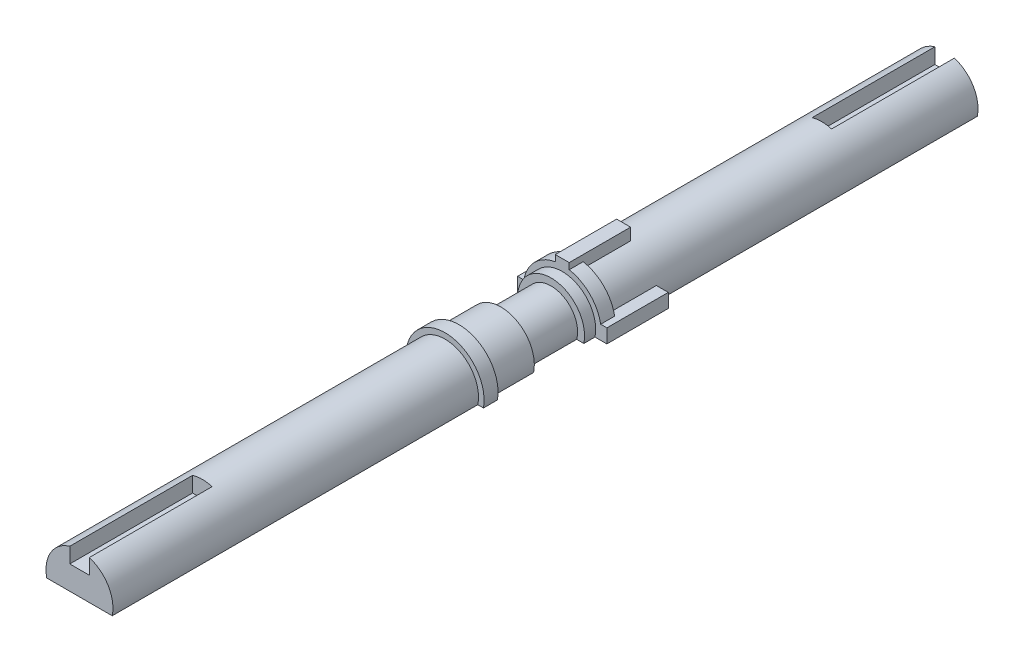
ISO-10303-21;
HEADER;
FILE_DESCRIPTION(('STEP AP214'),'2;1');
FILE_NAME('part.step','',(''),(''),'','','');
FILE_SCHEMA(('AUTOMOTIVE_DESIGN { 1 0 10303 214 1 1 1 1 }'));
ENDSEC;
DATA;
#1=APPLICATION_CONTEXT('core data for automotive mechanical design processes');
#2=APPLICATION_PROTOCOL_DEFINITION('international standard','automotive_design',2000,#1);
#3=PRODUCT_CONTEXT('',#1,'mechanical');
#4=PRODUCT('Part','Part','',(#3));
#5=PRODUCT_RELATED_PRODUCT_CATEGORY('part','',(#4));
#6=PRODUCT_DEFINITION_FORMATION('','',#4);
#7=PRODUCT_DEFINITION_CONTEXT('part definition',#1,'design');
#8=PRODUCT_DEFINITION('design','',#6,#7);
#9=PRODUCT_DEFINITION_SHAPE('','',#8);
#10=(LENGTH_UNIT() NAMED_UNIT(*) SI_UNIT(.MILLI.,.METRE.));
#11=(NAMED_UNIT(*) PLANE_ANGLE_UNIT() SI_UNIT($,.RADIAN.));
#12=(NAMED_UNIT(*) SI_UNIT($,.STERADIAN.) SOLID_ANGLE_UNIT());
#13=UNCERTAINTY_MEASURE_WITH_UNIT(LENGTH_MEASURE(1.E-05),#10,'distance_accuracy_value','');
#14=(GEOMETRIC_REPRESENTATION_CONTEXT(3) GLOBAL_UNCERTAINTY_ASSIGNED_CONTEXT((#13)) GLOBAL_UNIT_ASSIGNED_CONTEXT((#10,
#11,#12)) REPRESENTATION_CONTEXT('',''));
#15=CARTESIAN_POINT('',(0.,0.,0.));
#16=DIRECTION('',(0.,0.,1.));
#17=DIRECTION('',(1.,0.,0.));
#18=AXIS2_PLACEMENT_3D('',#15,#16,#17);
#19=CARTESIAN_POINT('',(0.,0.,26.5));
#20=DIRECTION('',(0.,0.,1.));
#21=DIRECTION('',(1.,0.,0.));
#22=AXIS2_PLACEMENT_3D('',#19,#20,#21);
#23=CYLINDRICAL_SURFACE('',#22,7.);
#24=CARTESIAN_POINT('',(0.,0.,29.));
#25=DIRECTION('',(0.,0.,1.));
#26=DIRECTION('',(1.,0.,0.));
#27=AXIS2_PLACEMENT_3D('',#24,#25,#26);
#28=CIRCLE('',#27,7.);
#29=CARTESIAN_POINT('',(6.88748865697795,-1.25,29.));
#30=VERTEX_POINT('',#29);
#31=CARTESIAN_POINT('',(-6.88748865697795,-1.25,29.));
#32=VERTEX_POINT('',#31);
#33=EDGE_CURVE('E77',#30,#32,#28,.T.);
#34=ORIENTED_EDGE('',*,*,#33,.F.);
#35=DIRECTION('',(0.,0.,1.));
#36=VECTOR('',#35,1.);
#37=CARTESIAN_POINT('',(6.88748865697795,-1.25,26.5));
#38=LINE('',#37,#36);
#39=CARTESIAN_POINT('',(6.88748865697795,-1.25,26.5));
#40=VERTEX_POINT('',#39);
#41=EDGE_CURVE('E12',#40,#30,#38,.T.);
#42=ORIENTED_EDGE('',*,*,#41,.F.);
#43=CARTESIAN_POINT('',(0.,0.,26.5));
#44=DIRECTION('',(0.,0.,1.));
#45=DIRECTION('',(1.,0.,0.));
#46=AXIS2_PLACEMENT_3D('',#43,#44,#45);
#47=CIRCLE('',#46,7.);
#48=CARTESIAN_POINT('',(-6.88748865697795,-1.25,26.5));
#49=VERTEX_POINT('',#48);
#50=EDGE_CURVE('E81',#40,#49,#47,.T.);
#51=ORIENTED_EDGE('',*,*,#50,.T.);
#52=DIRECTION('',(0.,0.,1.));
#53=VECTOR('',#52,1.);
#54=CARTESIAN_POINT('',(-6.88748865697795,-1.25,26.5));
#55=LINE('',#54,#53);
#56=EDGE_CURVE('E51',#49,#32,#55,.T.);
#57=ORIENTED_EDGE('',*,*,#56,.T.);
#58=EDGE_LOOP('',(#34,#42,#51,#57));
#59=FACE_BOUND('',#58,.T.);
#60=ADVANCED_FACE('F48',(#59),#23,.T.);
#61=CARTESIAN_POINT('',(-6.88748865697795,-1.25,26.5));
#62=DIRECTION('',(0.,-1.,0.));
#63=DIRECTION('',(1.,0.,0.));
#64=AXIS2_PLACEMENT_3D('',#61,#62,#63);
#65=PLANE('',#64);
#66=DIRECTION('',(1.,0.,0.));
#67=VECTOR('',#66,1.);
#68=CARTESIAN_POINT('',(-6.88748865697795,-1.25,29.));
#69=LINE('',#68,#67);
#70=EDGE_CURVE('E74',#32,#30,#69,.T.);
#71=ORIENTED_EDGE('',*,*,#70,.F.);
#72=ORIENTED_EDGE('',*,*,#56,.F.);
#73=DIRECTION('',(1.,0.,0.));
#74=VECTOR('',#73,1.);
#75=CARTESIAN_POINT('',(-6.88748865697795,-1.25,26.5));
#76=LINE('',#75,#74);
#77=EDGE_CURVE('E76',#49,#40,#76,.T.);
#78=ORIENTED_EDGE('',*,*,#77,.T.);
#79=ORIENTED_EDGE('',*,*,#41,.T.);
#80=EDGE_LOOP('',(#71,#72,#78,#79));
#81=FACE_BOUND('',#80,.T.);
#82=ADVANCED_FACE('F72',(#81),#65,.T.);
#83=CARTESIAN_POINT('',(0.,0.,26.5));
#84=DIRECTION('',(0.,0.,1.));
#85=DIRECTION('',(1.,0.,0.));
#86=AXIS2_PLACEMENT_3D('',#83,#84,#85);
#87=PLANE('',#86);
#88=ORIENTED_EDGE('',*,*,#50,.F.);
#89=ORIENTED_EDGE('',*,*,#77,.F.);
#90=EDGE_LOOP('',(#88,#89));
#91=FACE_BOUND('',#90,.T.);
#92=ADVANCED_FACE('F86',(#91),#87,.F.);
#93=CARTESIAN_POINT('',(0.,0.,29.));
#94=DIRECTION('',(0.,0.,1.));
#95=DIRECTION('',(1.,0.,0.));
#96=AXIS2_PLACEMENT_3D('',#93,#94,#95);
#97=PLANE('',#96);
#98=ORIENTED_EDGE('',*,*,#33,.T.);
#99=ORIENTED_EDGE('',*,*,#70,.T.);
#100=EDGE_LOOP('',(#98,#99));
#101=FACE_BOUND('',#100,.T.);
#102=ADVANCED_FACE('F80',(#101),#97,.T.);
#103=CLOSED_SHELL('',(#60,#82,#92,#102));
#104=MANIFOLD_SOLID_BREP('B2',#103);
#105=CARTESIAN_POINT('',(0.,0.,8.));
#106=DIRECTION('',(0.,0.,-1.));
#107=DIRECTION('',(-1.,0.,0.));
#108=AXIS2_PLACEMENT_3D('',#105,#106,#107);
#109=CYLINDRICAL_SURFACE('',#108,6.);
#110=CARTESIAN_POINT('',(0.,0.,10.));
#111=DIRECTION('',(0.,0.,1.));
#112=DIRECTION('',(1.,0.,0.));
#113=AXIS2_PLACEMENT_3D('',#110,#111,#112);
#114=CIRCLE('',#113,6.);
#115=CARTESIAN_POINT('',(5.86834729715275,-1.25,10.));
#116=VERTEX_POINT('',#115);
#117=CARTESIAN_POINT('',(-5.86834729715275,-1.25,10.));
#118=VERTEX_POINT('',#117);
#119=EDGE_CURVE('E324',#116,#118,#114,.T.);
#120=ORIENTED_EDGE('',*,*,#119,.F.);
#121=DIRECTION('',(0.,0.,-1.));
#122=VECTOR('',#121,1.);
#123=CARTESIAN_POINT('',(5.86834729715275,-1.25,34.));
#124=LINE('',#123,#122);
#125=CARTESIAN_POINT('',(5.86834729715275,-1.25,8.));
#126=VERTEX_POINT('',#125);
#127=EDGE_CURVE('E403',#116,#126,#124,.T.);
#128=ORIENTED_EDGE('',*,*,#127,.T.);
#129=CARTESIAN_POINT('',(0.,0.,8.));
#130=DIRECTION('',(0.,0.,1.));
#131=DIRECTION('',(1.,0.,0.));
#132=AXIS2_PLACEMENT_3D('',#129,#130,#131);
#133=CIRCLE('',#132,6.);
#134=CARTESIAN_POINT('',(-5.86834729715275,-1.25,8.));
#135=VERTEX_POINT('',#134);
#136=EDGE_CURVE('E389',#126,#135,#133,.T.);
#137=ORIENTED_EDGE('',*,*,#136,.T.);
#138=DIRECTION('',(0.,0.,-1.));
#139=VECTOR('',#138,1.);
#140=CARTESIAN_POINT('',(-5.86834729715275,-1.25,34.));
#141=LINE('',#140,#139);
#142=EDGE_CURVE('E343',#118,#135,#141,.T.);
#143=ORIENTED_EDGE('',*,*,#142,.F.);
#144=EDGE_LOOP('',(#120,#128,#137,#143));
#145=FACE_BOUND('',#144,.T.);
#146=ADVANCED_FACE('F119',(#145),#109,.T.);
#147=CARTESIAN_POINT('',(5.86834729715275,-1.25,94.5));
#148=VERTEX_POINT('',#147);
#149=CARTESIAN_POINT('',(5.86834729715275,-1.25,19.));
#150=VERTEX_POINT('',#149);
#151=EDGE_CURVE('E348',#148,#150,#124,.T.);
#152=ORIENTED_EDGE('',*,*,#151,.T.);
#153=CARTESIAN_POINT('',(0.,0.,19.));
#154=DIRECTION('',(0.,0.,1.));
#155=DIRECTION('',(1.,0.,0.));
#156=AXIS2_PLACEMENT_3D('',#153,#154,#155);
#157=CIRCLE('',#156,6.);
#158=CARTESIAN_POINT('',(-5.86834729715275,-1.25,19.));
#159=VERTEX_POINT('',#158);
#160=EDGE_CURVE('E531',#150,#159,#157,.T.);
#161=ORIENTED_EDGE('',*,*,#160,.T.);
#162=CARTESIAN_POINT('',(-5.86834729715276,-1.25,94.5));
#163=VERTEX_POINT('',#162);
#164=EDGE_CURVE('E337',#163,#159,#141,.T.);
#165=ORIENTED_EDGE('',*,*,#164,.F.);
#166=CARTESIAN_POINT('',(0.,0.,94.5));
#167=DIRECTION('',(0.,0.,1.));
#168=DIRECTION('',(1.,0.,0.));
#169=AXIS2_PLACEMENT_3D('',#166,#167,#168);
#170=CIRCLE('',#169,6.);
#171=CARTESIAN_POINT('',(-1.7379378772073,5.74278433644937,94.5));
#172=VERTEX_POINT('',#171);
#173=EDGE_CURVE('E476',#172,#163,#170,.T.);
#174=ORIENTED_EDGE('',*,*,#173,.F.);
#175=DIRECTION('',(0.,0.,1.));
#176=VECTOR('',#175,1.);
#177=CARTESIAN_POINT('',(-1.7379378772073,5.74278433644937,72.5));
#178=LINE('',#177,#176);
#179=CARTESIAN_POINT('',(-1.7379378772073,5.74278433644937,72.5));
#180=VERTEX_POINT('',#179);
#181=EDGE_CURVE('E142',#180,#172,#178,.T.);
#182=ORIENTED_EDGE('',*,*,#181,.F.);
#183=CARTESIAN_POINT('',(0.,0.,72.5));
#184=DIRECTION('',(0.,0.,-1.));
#185=DIRECTION('',(-1.,0.,0.));
#186=AXIS2_PLACEMENT_3D('',#183,#184,#185);
#187=CIRCLE('',#186,6.00000000000001);
#188=CARTESIAN_POINT('',(1.7620621227927,5.73542823818931,72.5));
#189=VERTEX_POINT('',#188);
#190=EDGE_CURVE('E525',#180,#189,#187,.T.);
#191=ORIENTED_EDGE('',*,*,#190,.T.);
#192=DIRECTION('',(0.,0.,1.));
#193=VECTOR('',#192,1.);
#194=CARTESIAN_POINT('',(1.7620621227927,5.73542823818931,72.5));
#195=LINE('',#194,#193);
#196=CARTESIAN_POINT('',(1.7620621227927,5.73542823818931,94.5));
#197=VERTEX_POINT('',#196);
#198=EDGE_CURVE('E503',#189,#197,#195,.T.);
#199=ORIENTED_EDGE('',*,*,#198,.T.);
#200=EDGE_CURVE('E473',#148,#197,#170,.T.);
#201=ORIENTED_EDGE('',*,*,#200,.F.);
#202=EDGE_LOOP('',(#152,#161,#165,#174,#182,#191,#199,#201));
#203=FACE_BOUND('',#202,.T.);
#204=ADVANCED_FACE('F546',(#203),#109,.T.);
#205=CARTESIAN_POINT('',(0.,0.,94.5));
#206=DIRECTION('',(0.,0.,1.));
#207=DIRECTION('',(1.,0.,0.));
#208=AXIS2_PLACEMENT_3D('',#205,#206,#207);
#209=PLANE('',#208);
#210=ORIENTED_EDGE('',*,*,#200,.T.);
#211=DIRECTION('',(0.,-1.,0.));
#212=VECTOR('',#211,1.);
#213=CARTESIAN_POINT('',(1.7620621227927,5.73542823818931,94.5));
#214=LINE('',#213,#212);
#215=CARTESIAN_POINT('',(1.76206212279273,2.99413329090053,94.5));
#216=VERTEX_POINT('',#215);
#217=EDGE_CURVE('E522',#197,#216,#214,.T.);
#218=ORIENTED_EDGE('',*,*,#217,.T.);
#219=DIRECTION('',(-1.,0.,0.));
#220=VECTOR('',#219,1.);
#221=CARTESIAN_POINT('',(1.76206212279273,2.99413329090053,94.5));
#222=LINE('',#221,#220);
#223=CARTESIAN_POINT('',(-1.73793787720727,2.99413329090049,94.5));
#224=VERTEX_POINT('',#223);
#225=EDGE_CURVE('E526',#216,#224,#222,.T.);
#226=ORIENTED_EDGE('',*,*,#225,.T.);
#227=DIRECTION('',(0.,1.,0.));
#228=VECTOR('',#227,1.);
#229=CARTESIAN_POINT('',(-1.7379378772073,5.74278433644937,94.5));
#230=LINE('',#229,#228);
#231=EDGE_CURVE('E529',#224,#172,#230,.T.);
#232=ORIENTED_EDGE('',*,*,#231,.T.);
#233=ORIENTED_EDGE('',*,*,#173,.T.);
#234=DIRECTION('',(1.,0.,0.));
#235=VECTOR('',#234,1.);
#236=CARTESIAN_POINT('',(-5.86834729715276,-1.25,94.5));
#237=LINE('',#236,#235);
#238=EDGE_CURVE('E339',#163,#148,#237,.T.);
#239=ORIENTED_EDGE('',*,*,#238,.T.);
#240=EDGE_LOOP('',(#210,#218,#226,#232,#233,#239));
#241=FACE_BOUND('',#240,.T.);
#242=ADVANCED_FACE('F549',(#241),#209,.T.);
#243=CARTESIAN_POINT('',(0.,0.,-38.5));
#244=DIRECTION('',(0.,0.,-1.));
#245=DIRECTION('',(-1.,0.,0.));
#246=AXIS2_PLACEMENT_3D('',#243,#244,#245);
#247=CIRCLE('',#246,6.00000000000001);
#248=CARTESIAN_POINT('',(-1.7379378772073,5.74278433644937,-38.5));
#249=VERTEX_POINT('',#248);
#250=CARTESIAN_POINT('',(1.7620621227927,5.73542823818931,-38.5));
#251=VERTEX_POINT('',#250);
#252=EDGE_CURVE('E496',#249,#251,#247,.T.);
#253=ORIENTED_EDGE('',*,*,#252,.F.);
#254=DIRECTION('',(0.,0.,-1.));
#255=VECTOR('',#254,1.);
#256=CARTESIAN_POINT('',(-1.7379378772073,5.74278433644937,-38.5));
#257=LINE('',#256,#255);
#258=CARTESIAN_POINT('',(-1.7379378772073,5.74278433644937,-60.5));
#259=VERTEX_POINT('',#258);
#260=EDGE_CURVE('E491',#249,#259,#257,.T.);
#261=ORIENTED_EDGE('',*,*,#260,.T.);
#262=CARTESIAN_POINT('',(0.,0.,-60.5));
#263=DIRECTION('',(0.,0.,-1.));
#264=DIRECTION('',(-1.,0.,0.));
#265=AXIS2_PLACEMENT_3D('',#262,#263,#264);
#266=CIRCLE('',#265,6.00000000000001);
#267=CARTESIAN_POINT('',(-5.86834729715276,-1.25,-60.5));
#268=VERTEX_POINT('',#267);
#269=EDGE_CURVE('E480',#268,#259,#266,.T.);
#270=ORIENTED_EDGE('',*,*,#269,.F.);
#271=DIRECTION('',(0.,0.,1.));
#272=VECTOR('',#271,1.);
#273=CARTESIAN_POINT('',(-5.86834729715276,-1.25,-8.));
#274=LINE('',#273,#272);
#275=CARTESIAN_POINT('',(-5.86834729715275,-1.25,-3.));
#276=VERTEX_POINT('',#275);
#277=EDGE_CURVE('E438',#268,#276,#274,.T.);
#278=ORIENTED_EDGE('',*,*,#277,.T.);
#279=CARTESIAN_POINT('',(0.,0.,-3.));
#280=DIRECTION('',(0.,0.,1.));
#281=DIRECTION('',(1.,0.,0.));
#282=AXIS2_PLACEMENT_3D('',#279,#280,#281);
#283=CIRCLE('',#282,6.);
#284=CARTESIAN_POINT('',(-5.86834729715275,1.25,-3.));
#285=VERTEX_POINT('',#284);
#286=EDGE_CURVE('E441',#285,#276,#283,.T.);
#287=ORIENTED_EDGE('',*,*,#286,.F.);
#288=DIRECTION('',(0.,0.,-1.));
#289=VECTOR('',#288,1.);
#290=CARTESIAN_POINT('',(-5.86834729715275,1.25,8.));
#291=LINE('',#290,#289);
#292=CARTESIAN_POINT('',(-5.86834729715275,1.25,5.5));
#293=VERTEX_POINT('',#292);
#294=EDGE_CURVE('E371',#293,#285,#291,.T.);
#295=ORIENTED_EDGE('',*,*,#294,.F.);
#296=CARTESIAN_POINT('',(0.,0.,5.5));
#297=DIRECTION('',(0.,0.,1.));
#298=DIRECTION('',(1.,0.,0.));
#299=AXIS2_PLACEMENT_3D('',#296,#297,#298);
#300=CIRCLE('',#299,6.);
#301=CARTESIAN_POINT('',(-1.25,5.86834729715275,5.5));
#302=VERTEX_POINT('',#301);
#303=EDGE_CURVE('E414',#302,#293,#300,.T.);
#304=ORIENTED_EDGE('',*,*,#303,.F.);
#305=DIRECTION('',(0.,0.,-1.));
#306=VECTOR('',#305,1.);
#307=CARTESIAN_POINT('',(-1.25,5.86834729715275,8.));
#308=LINE('',#307,#306);
#309=CARTESIAN_POINT('',(-1.25,5.86834729715275,-3.));
#310=VERTEX_POINT('',#309);
#311=EDGE_CURVE('E373',#302,#310,#308,.T.);
#312=ORIENTED_EDGE('',*,*,#311,.T.);
#313=CARTESIAN_POINT('',(0.,0.,-3.));
#314=DIRECTION('',(0.,0.,-1.));
#315=DIRECTION('',(-1.,0.,0.));
#316=AXIS2_PLACEMENT_3D('',#313,#314,#315);
#317=CIRCLE('',#316,6.);
#318=CARTESIAN_POINT('',(1.25,5.86834729715275,-3.));
#319=VERTEX_POINT('',#318);
#320=EDGE_CURVE('E392',#310,#319,#317,.T.);
#321=ORIENTED_EDGE('',*,*,#320,.T.);
#322=DIRECTION('',(0.,0.,-1.));
#323=VECTOR('',#322,1.);
#324=CARTESIAN_POINT('',(1.25,5.86834729715275,8.));
#325=LINE('',#324,#323);
#326=CARTESIAN_POINT('',(1.25,5.86834729715275,5.5));
#327=VERTEX_POINT('',#326);
#328=EDGE_CURVE('E379',#327,#319,#325,.T.);
#329=ORIENTED_EDGE('',*,*,#328,.F.);
#330=CARTESIAN_POINT('',(5.86834729715275,1.25,5.5));
#331=VERTEX_POINT('',#330);
#332=EDGE_CURVE('E411',#331,#327,#300,.T.);
#333=ORIENTED_EDGE('',*,*,#332,.F.);
#334=DIRECTION('',(0.,0.,-1.));
#335=VECTOR('',#334,1.);
#336=CARTESIAN_POINT('',(5.86834729715275,1.25,8.));
#337=LINE('',#336,#335);
#338=CARTESIAN_POINT('',(5.86834729715275,1.25,-3.));
#339=VERTEX_POINT('',#338);
#340=EDGE_CURVE('E381',#331,#339,#337,.T.);
#341=ORIENTED_EDGE('',*,*,#340,.T.);
#342=CARTESIAN_POINT('',(0.,0.,-3.));
#343=DIRECTION('',(0.,0.,-1.));
#344=DIRECTION('',(-1.,0.,0.));
#345=AXIS2_PLACEMENT_3D('',#342,#343,#344);
#346=CIRCLE('',#345,6.);
#347=CARTESIAN_POINT('',(5.86834729715275,-1.25,-3.));
#348=VERTEX_POINT('',#347);
#349=EDGE_CURVE('E443',#339,#348,#346,.T.);
#350=ORIENTED_EDGE('',*,*,#349,.T.);
#351=DIRECTION('',(0.,0.,1.));
#352=VECTOR('',#351,1.);
#353=CARTESIAN_POINT('',(5.86834729715276,-1.25,-8.));
#354=LINE('',#353,#352);
#355=CARTESIAN_POINT('',(5.86834729715275,-1.25000000000001,-60.5));
#356=VERTEX_POINT('',#355);
#357=EDGE_CURVE('E432',#356,#348,#354,.T.);
#358=ORIENTED_EDGE('',*,*,#357,.F.);
#359=CARTESIAN_POINT('',(1.7620621227927,5.73542823818931,-60.5));
#360=VERTEX_POINT('',#359);
#361=EDGE_CURVE('E483',#360,#356,#266,.T.);
#362=ORIENTED_EDGE('',*,*,#361,.F.);
#363=DIRECTION('',(0.,0.,-1.));
#364=VECTOR('',#363,1.);
#365=CARTESIAN_POINT('',(1.7620621227927,5.73542823818931,-38.5));
#366=LINE('',#365,#364);
#367=EDGE_CURVE('E484',#251,#360,#366,.T.);
#368=ORIENTED_EDGE('',*,*,#367,.F.);
#369=EDGE_LOOP('',(#253,#261,#270,#278,#287,#295,#304,#312,#321,#329,#333,#341,#350,#358,#362,#368));
#370=FACE_BOUND('',#369,.T.);
#371=ADVANCED_FACE('F574',(#370),#109,.T.);
#372=CARTESIAN_POINT('',(-7.99999999999999,1.25,8.));
#373=DIRECTION('',(1.,0.,0.));
#374=DIRECTION('',(0.,0.,-1.));
#375=AXIS2_PLACEMENT_3D('',#372,#373,#374);
#376=PLANE('',#375);
#377=DIRECTION('',(0.,0.,-1.));
#378=VECTOR('',#377,1.);
#379=CARTESIAN_POINT('',(-7.99999999999999,1.25,8.));
#380=LINE('',#379,#378);
#381=CARTESIAN_POINT('',(-7.99999999999999,1.25,8.));
#382=VERTEX_POINT('',#381);
#383=CARTESIAN_POINT('',(-7.99999999999999,1.25,-3.));
#384=VERTEX_POINT('',#383);
#385=EDGE_CURVE('E369',#382,#384,#380,.T.);
#386=ORIENTED_EDGE('',*,*,#385,.T.);
#387=DIRECTION('',(0.,1.,0.));
#388=VECTOR('',#387,1.);
#389=CARTESIAN_POINT('',(-7.99999999999999,1.25,-3.));
#390=LINE('',#389,#388);
#391=CARTESIAN_POINT('',(-7.99999999999999,-1.25,-3.));
#392=VERTEX_POINT('',#391);
#393=EDGE_CURVE('E456',#392,#384,#390,.T.);
#394=ORIENTED_EDGE('',*,*,#393,.F.);
#395=DIRECTION('',(0.,0.,-1.));
#396=VECTOR('',#395,1.);
#397=CARTESIAN_POINT('',(-7.99999999999999,-1.25,8.));
#398=LINE('',#397,#396);
#399=CARTESIAN_POINT('',(-7.99999999999999,-1.25,8.));
#400=VERTEX_POINT('',#399);
#401=EDGE_CURVE('E387',#400,#392,#398,.T.);
#402=ORIENTED_EDGE('',*,*,#401,.F.);
#403=DIRECTION('',(0.,-1.,0.));
#404=VECTOR('',#403,1.);
#405=CARTESIAN_POINT('',(-7.99999999999999,1.25,8.));
#406=LINE('',#405,#404);
#407=EDGE_CURVE('E342',#382,#400,#406,.T.);
#408=ORIENTED_EDGE('',*,*,#407,.F.);
#409=EDGE_LOOP('',(#386,#394,#402,#408));
#410=FACE_BOUND('',#409,.T.);
#411=ADVANCED_FACE('F121',(#410),#376,.F.);
#412=CARTESIAN_POINT('',(8.00000000000001,-1.25,8.));
#413=DIRECTION('',(0.,1.,0.));
#414=DIRECTION('',(-1.,0.,0.));
#415=AXIS2_PLACEMENT_3D('',#412,#413,#414);
#416=PLANE('',#415);
#417=ORIENTED_EDGE('',*,*,#164,.T.);
#418=DIRECTION('',(1.,0.,0.));
#419=VECTOR('',#418,1.);
#420=CARTESIAN_POINT('',(8.00000000000001,-1.25,19.));
#421=LINE('',#420,#419);
#422=CARTESIAN_POINT('',(-4.58257569495584,-1.24999999999999,19.));
#423=VERTEX_POINT('',#422);
#424=EDGE_CURVE('E46',#159,#423,#421,.T.);
#425=ORIENTED_EDGE('',*,*,#424,.T.);
#426=DIRECTION('',(0.,0.,-1.));
#427=VECTOR('',#426,1.);
#428=CARTESIAN_POINT('',(-4.58257569495584,-1.24999999999999,19.));
#429=LINE('',#428,#427);
#430=CARTESIAN_POINT('',(-4.58257569495584,-1.24999999999999,10.));
#431=VERTEX_POINT('',#430);
#432=EDGE_CURVE('E316',#423,#431,#429,.T.);
#433=ORIENTED_EDGE('',*,*,#432,.T.);
#434=DIRECTION('',(1.,0.,0.));
#435=VECTOR('',#434,1.);
#436=CARTESIAN_POINT('',(8.00000000000001,-1.25,10.));
#437=LINE('',#436,#435);
#438=EDGE_CURVE('E127',#118,#431,#437,.T.);
#439=ORIENTED_EDGE('',*,*,#438,.F.);
#440=ORIENTED_EDGE('',*,*,#142,.T.);
#441=DIRECTION('',(1.,0.,0.));
#442=VECTOR('',#441,1.);
#443=CARTESIAN_POINT('',(8.00000000000001,-1.25,8.));
#444=LINE('',#443,#442);
#445=EDGE_CURVE('E352',#400,#135,#444,.T.);
#446=ORIENTED_EDGE('',*,*,#445,.F.);
#447=ORIENTED_EDGE('',*,*,#401,.T.);
#448=DIRECTION('',(-1.,0.,0.));
#449=VECTOR('',#448,1.);
#450=CARTESIAN_POINT('',(-7.99999999999999,-1.25,-3.));
#451=LINE('',#450,#449);
#452=EDGE_CURVE('E450',#276,#392,#451,.T.);
#453=ORIENTED_EDGE('',*,*,#452,.F.);
#454=ORIENTED_EDGE('',*,*,#277,.F.);
#455=DIRECTION('',(-1.,0.,0.));
#456=VECTOR('',#455,1.);
#457=CARTESIAN_POINT('',(5.86834729715275,-1.25000000000001,-60.5));
#458=LINE('',#457,#456);
#459=EDGE_CURVE('E477',#356,#268,#458,.T.);
#460=ORIENTED_EDGE('',*,*,#459,.F.);
#461=ORIENTED_EDGE('',*,*,#357,.T.);
#462=DIRECTION('',(-1.,0.,0.));
#463=VECTOR('',#462,1.);
#464=CARTESIAN_POINT('',(8.00000000000001,-1.25,-3.));
#465=LINE('',#464,#463);
#466=CARTESIAN_POINT('',(8.00000000000001,-1.25,-3.));
#467=VERTEX_POINT('',#466);
#468=EDGE_CURVE('E451',#467,#348,#465,.T.);
#469=ORIENTED_EDGE('',*,*,#468,.F.);
#470=DIRECTION('',(0.,0.,-1.));
#471=VECTOR('',#470,1.);
#472=CARTESIAN_POINT('',(8.00000000000001,-1.25,8.));
#473=LINE('',#472,#471);
#474=CARTESIAN_POINT('',(8.00000000000001,-1.25,8.));
#475=VERTEX_POINT('',#474);
#476=EDGE_CURVE('E385',#475,#467,#473,.T.);
#477=ORIENTED_EDGE('',*,*,#476,.F.);
#478=EDGE_CURVE('E346',#126,#475,#444,.T.);
#479=ORIENTED_EDGE('',*,*,#478,.F.);
#480=ORIENTED_EDGE('',*,*,#127,.F.);
#481=DIRECTION('',(1.,0.,0.));
#482=VECTOR('',#481,1.);
#483=CARTESIAN_POINT('',(4.58257569495584,-1.25,10.));
#484=LINE('',#483,#482);
#485=CARTESIAN_POINT('',(4.58257569495584,-1.25,10.));
#486=VERTEX_POINT('',#485);
#487=EDGE_CURVE('E331',#486,#116,#484,.T.);
#488=ORIENTED_EDGE('',*,*,#487,.F.);
#489=DIRECTION('',(0.,0.,-1.));
#490=VECTOR('',#489,1.);
#491=CARTESIAN_POINT('',(4.58257569495584,-1.25,19.));
#492=LINE('',#491,#490);
#493=CARTESIAN_POINT('',(4.58257569495584,-1.25,19.));
#494=VERTEX_POINT('',#493);
#495=EDGE_CURVE('E134',#494,#486,#492,.T.);
#496=ORIENTED_EDGE('',*,*,#495,.F.);
#497=DIRECTION('',(1.,0.,0.));
#498=VECTOR('',#497,1.);
#499=CARTESIAN_POINT('',(4.58257569495584,-1.25,19.));
#500=LINE('',#499,#498);
#501=EDGE_CURVE('E330',#494,#150,#500,.T.);
#502=ORIENTED_EDGE('',*,*,#501,.T.);
#503=ORIENTED_EDGE('',*,*,#151,.F.);
#504=ORIENTED_EDGE('',*,*,#238,.F.);
#505=EDGE_LOOP('',(#417,#425,#433,#439,#440,#446,#447,#453,#454,#460,#461,#469,#477,#479,#480,
#488,#496,#502,#503,#504));
#506=FACE_BOUND('',#505,.T.);
#507=ADVANCED_FACE('F334',(#506),#416,.F.);
#508=CARTESIAN_POINT('',(8.00000000000001,1.25,8.));
#509=DIRECTION('',(-1.,0.,0.));
#510=DIRECTION('',(0.,0.,1.));
#511=AXIS2_PLACEMENT_3D('',#508,#509,#510);
#512=PLANE('',#511);
#513=ORIENTED_EDGE('',*,*,#476,.T.);
#514=DIRECTION('',(0.,-1.,0.));
#515=VECTOR('',#514,1.);
#516=CARTESIAN_POINT('',(8.00000000000001,1.25,-3.));
#517=LINE('',#516,#515);
#518=CARTESIAN_POINT('',(8.00000000000001,1.25,-3.));
#519=VERTEX_POINT('',#518);
#520=EDGE_CURVE('E447',#519,#467,#517,.T.);
#521=ORIENTED_EDGE('',*,*,#520,.F.);
#522=DIRECTION('',(0.,0.,-1.));
#523=VECTOR('',#522,1.);
#524=CARTESIAN_POINT('',(8.00000000000001,1.25,8.));
#525=LINE('',#524,#523);
#526=CARTESIAN_POINT('',(8.00000000000001,1.25,8.));
#527=VERTEX_POINT('',#526);
#528=EDGE_CURVE('E383',#527,#519,#525,.T.);
#529=ORIENTED_EDGE('',*,*,#528,.F.);
#530=DIRECTION('',(0.,1.,0.));
#531=VECTOR('',#530,1.);
#532=CARTESIAN_POINT('',(8.00000000000001,1.25,8.));
#533=LINE('',#532,#531);
#534=EDGE_CURVE('E355',#475,#527,#533,.T.);
#535=ORIENTED_EDGE('',*,*,#534,.F.);
#536=EDGE_LOOP('',(#513,#521,#529,#535));
#537=FACE_BOUND('',#536,.T.);
#538=ADVANCED_FACE('F657',(#537),#512,.F.);
#539=CARTESIAN_POINT('',(8.00000000000001,1.25,8.));
#540=DIRECTION('',(0.,-1.,0.));
#541=DIRECTION('',(1.,0.,0.));
#542=AXIS2_PLACEMENT_3D('',#539,#540,#541);
#543=PLANE('',#542);
#544=DIRECTION('',(-1.,0.,0.));
#545=VECTOR('',#544,1.);
#546=CARTESIAN_POINT('',(8.00000000000001,1.25,5.5));
#547=LINE('',#546,#545);
#548=CARTESIAN_POINT('',(6.88748865697796,1.25,5.5));
#549=VERTEX_POINT('',#548);
#550=EDGE_CURVE('E407',#549,#331,#547,.T.);
#551=ORIENTED_EDGE('',*,*,#550,.F.);
#552=DIRECTION('',(0.,0.,1.));
#553=VECTOR('',#552,1.);
#554=CARTESIAN_POINT('',(6.88748865697796,1.25,5.5));
#555=LINE('',#554,#553);
#556=CARTESIAN_POINT('',(6.88748865697796,1.25,8.));
#557=VERTEX_POINT('',#556);
#558=EDGE_CURVE('E416',#549,#557,#555,.T.);
#559=ORIENTED_EDGE('',*,*,#558,.T.);
#560=DIRECTION('',(-1.,0.,0.));
#561=VECTOR('',#560,1.);
#562=CARTESIAN_POINT('',(8.00000000000001,1.25,8.));
#563=LINE('',#562,#561);
#564=EDGE_CURVE('E357',#527,#557,#563,.T.);
#565=ORIENTED_EDGE('',*,*,#564,.F.);
#566=ORIENTED_EDGE('',*,*,#528,.T.);
#567=DIRECTION('',(1.,0.,0.));
#568=VECTOR('',#567,1.);
#569=CARTESIAN_POINT('',(8.00000000000001,1.25,-3.));
#570=LINE('',#569,#568);
#571=EDGE_CURVE('E453',#339,#519,#570,.T.);
#572=ORIENTED_EDGE('',*,*,#571,.F.);
#573=ORIENTED_EDGE('',*,*,#340,.F.);
#574=EDGE_LOOP('',(#551,#559,#565,#566,#572,#573));
#575=FACE_BOUND('',#574,.T.);
#576=ADVANCED_FACE('F650',(#575),#543,.F.);
#577=CARTESIAN_POINT('',(1.25,8.,8.));
#578=DIRECTION('',(-1.,0.,0.));
#579=DIRECTION('',(0.,-1.,0.));
#580=AXIS2_PLACEMENT_3D('',#577,#578,#579);
#581=PLANE('',#580);
#582=DIRECTION('',(0.,1.,0.));
#583=VECTOR('',#582,1.);
#584=CARTESIAN_POINT('',(1.25,8.,8.));
#585=LINE('',#584,#583);
#586=CARTESIAN_POINT('',(1.25,6.88748865697796,8.));
#587=VERTEX_POINT('',#586);
#588=CARTESIAN_POINT('',(1.25,8.,8.));
#589=VERTEX_POINT('',#588);
#590=EDGE_CURVE('E360',#587,#589,#585,.T.);
#591=ORIENTED_EDGE('',*,*,#590,.F.);
#592=DIRECTION('',(0.,0.,1.));
#593=VECTOR('',#592,1.);
#594=CARTESIAN_POINT('',(1.25,6.88748865697796,5.5));
#595=LINE('',#594,#593);
#596=CARTESIAN_POINT('',(1.25,6.88748865697796,5.5));
#597=VERTEX_POINT('',#596);
#598=EDGE_CURVE('E419',#587,#597,#595,.F.);
#599=ORIENTED_EDGE('',*,*,#598,.T.);
#600=DIRECTION('',(0.,1.,0.));
#601=VECTOR('',#600,1.);
#602=CARTESIAN_POINT('',(1.25,8.,5.5));
#603=LINE('',#602,#601);
#604=EDGE_CURVE('E409',#327,#597,#603,.T.);
#605=ORIENTED_EDGE('',*,*,#604,.F.);
#606=ORIENTED_EDGE('',*,*,#328,.T.);
#607=DIRECTION('',(0.,-1.,0.));
#608=VECTOR('',#607,1.);
#609=CARTESIAN_POINT('',(1.25,8.,-3.));
#610=LINE('',#609,#608);
#611=CARTESIAN_POINT('',(1.25,8.,-3.));
#612=VERTEX_POINT('',#611);
#613=EDGE_CURVE('E459',#612,#319,#610,.T.);
#614=ORIENTED_EDGE('',*,*,#613,.F.);
#615=DIRECTION('',(0.,0.,-1.));
#616=VECTOR('',#615,1.);
#617=CARTESIAN_POINT('',(1.25,8.,8.));
#618=LINE('',#617,#616);
#619=EDGE_CURVE('E377',#589,#612,#618,.T.);
#620=ORIENTED_EDGE('',*,*,#619,.F.);
#621=EDGE_LOOP('',(#591,#599,#605,#606,#614,#620));
#622=FACE_BOUND('',#621,.T.);
#623=ADVANCED_FACE('F640',(#622),#581,.F.);
#624=CARTESIAN_POINT('',(-1.25,8.,8.));
#625=DIRECTION('',(0.,-1.,0.));
#626=DIRECTION('',(0.,0.,-1.));
#627=AXIS2_PLACEMENT_3D('',#624,#625,#626);
#628=PLANE('',#627);
#629=ORIENTED_EDGE('',*,*,#619,.T.);
#630=DIRECTION('',(1.,0.,0.));
#631=VECTOR('',#630,1.);
#632=CARTESIAN_POINT('',(1.25,8.,-3.));
#633=LINE('',#632,#631);
#634=CARTESIAN_POINT('',(-1.25,8.,-3.));
#635=VERTEX_POINT('',#634);
#636=EDGE_CURVE('E446',#635,#612,#633,.T.);
#637=ORIENTED_EDGE('',*,*,#636,.F.);
#638=DIRECTION('',(0.,0.,-1.));
#639=VECTOR('',#638,1.);
#640=CARTESIAN_POINT('',(-1.25,8.,8.));
#641=LINE('',#640,#639);
#642=CARTESIAN_POINT('',(-1.25,8.,8.));
#643=VERTEX_POINT('',#642);
#644=EDGE_CURVE('E375',#643,#635,#641,.T.);
#645=ORIENTED_EDGE('',*,*,#644,.F.);
#646=DIRECTION('',(-1.,0.,0.));
#647=VECTOR('',#646,1.);
#648=CARTESIAN_POINT('',(-1.25,8.,8.));
#649=LINE('',#648,#647);
#650=EDGE_CURVE('E362',#589,#643,#649,.T.);
#651=ORIENTED_EDGE('',*,*,#650,.F.);
#652=EDGE_LOOP('',(#629,#637,#645,#651));
#653=FACE_BOUND('',#652,.T.);
#654=ADVANCED_FACE('F635',(#653),#628,.F.);
#655=CARTESIAN_POINT('',(-1.25,8.,8.));
#656=DIRECTION('',(1.,0.,0.));
#657=DIRECTION('',(0.,0.,-1.));
#658=AXIS2_PLACEMENT_3D('',#655,#656,#657);
#659=PLANE('',#658);
#660=DIRECTION('',(0.,-1.,0.));
#661=VECTOR('',#660,1.);
#662=CARTESIAN_POINT('',(-1.25,8.,5.5));
#663=LINE('',#662,#661);
#664=CARTESIAN_POINT('',(-1.25,6.88748865697796,5.5));
#665=VERTEX_POINT('',#664);
#666=EDGE_CURVE('E412',#665,#302,#663,.T.);
#667=ORIENTED_EDGE('',*,*,#666,.F.);
#668=DIRECTION('',(0.,0.,1.));
#669=VECTOR('',#668,1.);
#670=CARTESIAN_POINT('',(-1.25,6.88748865697796,5.5));
#671=LINE('',#670,#669);
#672=CARTESIAN_POINT('',(-1.25,6.88748865697796,8.));
#673=VERTEX_POINT('',#672);
#674=EDGE_CURVE('E422',#665,#673,#671,.T.);
#675=ORIENTED_EDGE('',*,*,#674,.T.);
#676=DIRECTION('',(0.,-1.,0.));
#677=VECTOR('',#676,1.);
#678=CARTESIAN_POINT('',(-1.25,8.,8.));
#679=LINE('',#678,#677);
#680=EDGE_CURVE('E364',#643,#673,#679,.T.);
#681=ORIENTED_EDGE('',*,*,#680,.F.);
#682=ORIENTED_EDGE('',*,*,#644,.T.);
#683=DIRECTION('',(0.,1.,0.));
#684=VECTOR('',#683,1.);
#685=CARTESIAN_POINT('',(-1.25,8.,-3.));
#686=LINE('',#685,#684);
#687=EDGE_CURVE('E467',#310,#635,#686,.T.);
#688=ORIENTED_EDGE('',*,*,#687,.F.);
#689=ORIENTED_EDGE('',*,*,#311,.F.);
#690=EDGE_LOOP('',(#667,#675,#681,#682,#688,#689));
#691=FACE_BOUND('',#690,.T.);
#692=ADVANCED_FACE('F627',(#691),#659,.F.);
#693=CARTESIAN_POINT('',(-5.86834729715275,1.25,8.));
#694=DIRECTION('',(0.,-1.,0.));
#695=DIRECTION('',(1.,0.,0.));
#696=AXIS2_PLACEMENT_3D('',#693,#694,#695);
#697=PLANE('',#696);
#698=DIRECTION('',(-1.,0.,0.));
#699=VECTOR('',#698,1.);
#700=CARTESIAN_POINT('',(-5.86834729715275,1.25,8.));
#701=LINE('',#700,#699);
#702=CARTESIAN_POINT('',(-6.88748865697796,1.25,8.));
#703=VERTEX_POINT('',#702);
#704=EDGE_CURVE('E367',#703,#382,#701,.T.);
#705=ORIENTED_EDGE('',*,*,#704,.F.);
#706=DIRECTION('',(0.,0.,1.));
#707=VECTOR('',#706,1.);
#708=CARTESIAN_POINT('',(-6.88748865697796,1.25,5.5));
#709=LINE('',#708,#707);
#710=CARTESIAN_POINT('',(-6.88748865697796,1.25,5.5));
#711=VERTEX_POINT('',#710);
#712=EDGE_CURVE('E425',#703,#711,#709,.F.);
#713=ORIENTED_EDGE('',*,*,#712,.T.);
#714=DIRECTION('',(-1.,0.,0.));
#715=VECTOR('',#714,1.);
#716=CARTESIAN_POINT('',(-5.86834729715275,1.25,5.5));
#717=LINE('',#716,#715);
#718=EDGE_CURVE('E390',#293,#711,#717,.T.);
#719=ORIENTED_EDGE('',*,*,#718,.F.);
#720=ORIENTED_EDGE('',*,*,#294,.T.);
#721=DIRECTION('',(1.,0.,0.));
#722=VECTOR('',#721,1.);
#723=CARTESIAN_POINT('',(-7.99999999999999,1.25,-3.));
#724=LINE('',#723,#722);
#725=EDGE_CURVE('E460',#384,#285,#724,.T.);
#726=ORIENTED_EDGE('',*,*,#725,.F.);
#727=ORIENTED_EDGE('',*,*,#385,.F.);
#728=EDGE_LOOP('',(#705,#713,#719,#720,#726,#727));
#729=FACE_BOUND('',#728,.T.);
#730=ADVANCED_FACE('F618',(#729),#697,.F.);
#731=CARTESIAN_POINT('',(0.,0.,8.));
#732=DIRECTION('',(0.,0.,1.));
#733=DIRECTION('',(1.,0.,0.));
#734=AXIS2_PLACEMENT_3D('',#731,#732,#733);
#735=PLANE('',#734);
#736=ORIENTED_EDGE('',*,*,#445,.T.);
#737=ORIENTED_EDGE('',*,*,#136,.F.);
#738=ORIENTED_EDGE('',*,*,#478,.T.);
#739=ORIENTED_EDGE('',*,*,#534,.T.);
#740=ORIENTED_EDGE('',*,*,#564,.T.);
#741=CARTESIAN_POINT('',(0.,0.,8.));
#742=DIRECTION('',(0.,0.,1.));
#743=DIRECTION('',(1.,0.,0.));
#744=AXIS2_PLACEMENT_3D('',#741,#742,#743);
#745=CIRCLE('',#744,7.);
#746=EDGE_CURVE('E431',#557,#587,#745,.T.);
#747=ORIENTED_EDGE('',*,*,#746,.T.);
#748=ORIENTED_EDGE('',*,*,#590,.T.);
#749=ORIENTED_EDGE('',*,*,#650,.T.);
#750=ORIENTED_EDGE('',*,*,#680,.T.);
#751=EDGE_CURVE('E429',#673,#703,#745,.T.);
#752=ORIENTED_EDGE('',*,*,#751,.T.);
#753=ORIENTED_EDGE('',*,*,#704,.T.);
#754=ORIENTED_EDGE('',*,*,#407,.T.);
#755=EDGE_LOOP('',(#736,#737,#738,#739,#740,#747,#748,#749,#750,#752,#753,#754));
#756=FACE_BOUND('',#755,.T.);
#757=ADVANCED_FACE('F690',(#756),#735,.T.);
#758=CARTESIAN_POINT('',(0.,0.,5.5));
#759=DIRECTION('',(0.,0.,1.));
#760=DIRECTION('',(1.,0.,0.));
#761=AXIS2_PLACEMENT_3D('',#758,#759,#760);
#762=PLANE('',#761);
#763=CARTESIAN_POINT('',(0.,0.,5.5));
#764=DIRECTION('',(0.,0.,1.));
#765=DIRECTION('',(1.,0.,0.));
#766=AXIS2_PLACEMENT_3D('',#763,#764,#765);
#767=CIRCLE('',#766,7.);
#768=EDGE_CURVE('E433',#665,#711,#767,.T.);
#769=ORIENTED_EDGE('',*,*,#768,.F.);
#770=ORIENTED_EDGE('',*,*,#666,.T.);
#771=ORIENTED_EDGE('',*,*,#303,.T.);
#772=ORIENTED_EDGE('',*,*,#718,.T.);
#773=EDGE_LOOP('',(#769,#770,#771,#772));
#774=FACE_BOUND('',#773,.T.);
#775=ADVANCED_FACE('F686',(#774),#762,.F.);
#776=CARTESIAN_POINT('',(0.,0.,5.5));
#777=DIRECTION('',(0.,0.,1.));
#778=DIRECTION('',(1.,0.,0.));
#779=AXIS2_PLACEMENT_3D('',#776,#777,#778);
#780=CYLINDRICAL_SURFACE('',#779,7.);
#781=ORIENTED_EDGE('',*,*,#674,.F.);
#782=ORIENTED_EDGE('',*,*,#768,.T.);
#783=ORIENTED_EDGE('',*,*,#712,.F.);
#784=ORIENTED_EDGE('',*,*,#751,.F.);
#785=EDGE_LOOP('',(#781,#782,#783,#784));
#786=FACE_BOUND('',#785,.T.);
#787=ADVANCED_FACE('F685',(#786),#780,.T.);
#788=EDGE_CURVE('E428',#549,#597,#767,.T.);
#789=ORIENTED_EDGE('',*,*,#788,.F.);
#790=ORIENTED_EDGE('',*,*,#550,.T.);
#791=ORIENTED_EDGE('',*,*,#332,.T.);
#792=ORIENTED_EDGE('',*,*,#604,.T.);
#793=EDGE_LOOP('',(#789,#790,#791,#792));
#794=FACE_BOUND('',#793,.T.);
#795=ADVANCED_FACE('F682',(#794),#762,.F.);
#796=ORIENTED_EDGE('',*,*,#558,.F.);
#797=ORIENTED_EDGE('',*,*,#788,.T.);
#798=ORIENTED_EDGE('',*,*,#598,.F.);
#799=ORIENTED_EDGE('',*,*,#746,.F.);
#800=EDGE_LOOP('',(#796,#797,#798,#799));
#801=FACE_BOUND('',#800,.T.);
#802=ADVANCED_FACE('F681',(#801),#780,.T.);
#803=CARTESIAN_POINT('',(0.,0.,-3.));
#804=DIRECTION('',(0.,0.,-1.));
#805=DIRECTION('',(-1.,0.,0.));
#806=AXIS2_PLACEMENT_3D('',#803,#804,#805);
#807=PLANE('',#806);
#808=ORIENTED_EDGE('',*,*,#349,.F.);
#809=ORIENTED_EDGE('',*,*,#571,.T.);
#810=ORIENTED_EDGE('',*,*,#520,.T.);
#811=ORIENTED_EDGE('',*,*,#468,.T.);
#812=EDGE_LOOP('',(#808,#809,#810,#811));
#813=FACE_BOUND('',#812,.T.);
#814=ADVANCED_FACE('F655',(#813),#807,.T.);
#815=CARTESIAN_POINT('',(0.,0.,-3.));
#816=DIRECTION('',(0.,0.,1.));
#817=DIRECTION('',(1.,0.,0.));
#818=AXIS2_PLACEMENT_3D('',#815,#816,#817);
#819=PLANE('',#818);
#820=ORIENTED_EDGE('',*,*,#725,.T.);
#821=ORIENTED_EDGE('',*,*,#286,.T.);
#822=ORIENTED_EDGE('',*,*,#452,.T.);
#823=ORIENTED_EDGE('',*,*,#393,.T.);
#824=EDGE_LOOP('',(#820,#821,#822,#823));
#825=FACE_BOUND('',#824,.T.);
#826=ADVANCED_FACE('F612',(#825),#819,.F.);
#827=CARTESIAN_POINT('',(0.,0.,-3.));
#828=DIRECTION('',(0.,0.,-1.));
#829=DIRECTION('',(-1.,0.,0.));
#830=AXIS2_PLACEMENT_3D('',#827,#828,#829);
#831=PLANE('',#830);
#832=ORIENTED_EDGE('',*,*,#320,.F.);
#833=ORIENTED_EDGE('',*,*,#687,.T.);
#834=ORIENTED_EDGE('',*,*,#636,.T.);
#835=ORIENTED_EDGE('',*,*,#613,.T.);
#836=EDGE_LOOP('',(#832,#833,#834,#835));
#837=FACE_BOUND('',#836,.T.);
#838=ADVANCED_FACE('F632',(#837),#831,.T.);
#839=CARTESIAN_POINT('',(0.,0.,-60.5));
#840=DIRECTION('',(0.,0.,-1.));
#841=DIRECTION('',(-1.,0.,0.));
#842=AXIS2_PLACEMENT_3D('',#839,#840,#841);
#843=PLANE('',#842);
#844=DIRECTION('',(0.,1.,0.));
#845=VECTOR('',#844,1.);
#846=CARTESIAN_POINT('',(-1.7379378772073,5.74278433644937,-60.5));
#847=LINE('',#846,#845);
#848=CARTESIAN_POINT('',(-1.73793787720727,2.99413329090049,-60.5));
#849=VERTEX_POINT('',#848);
#850=EDGE_CURVE('E494',#849,#259,#847,.T.);
#851=ORIENTED_EDGE('',*,*,#850,.F.);
#852=DIRECTION('',(-1.,0.,0.));
#853=VECTOR('',#852,1.);
#854=CARTESIAN_POINT('',(1.76206212279273,2.99413329090053,-60.5));
#855=LINE('',#854,#853);
#856=CARTESIAN_POINT('',(1.76206212279273,2.99413329090053,-60.5));
#857=VERTEX_POINT('',#856);
#858=EDGE_CURVE('E497',#857,#849,#855,.T.);
#859=ORIENTED_EDGE('',*,*,#858,.F.);
#860=DIRECTION('',(0.,-1.,0.));
#861=VECTOR('',#860,1.);
#862=CARTESIAN_POINT('',(1.7620621227927,5.73542823818931,-60.5));
#863=LINE('',#862,#861);
#864=EDGE_CURVE('E500',#360,#857,#863,.T.);
#865=ORIENTED_EDGE('',*,*,#864,.F.);
#866=ORIENTED_EDGE('',*,*,#361,.T.);
#867=ORIENTED_EDGE('',*,*,#459,.T.);
#868=ORIENTED_EDGE('',*,*,#269,.T.);
#869=EDGE_LOOP('',(#851,#859,#865,#866,#867,#868));
#870=FACE_BOUND('',#869,.T.);
#871=ADVANCED_FACE('F603',(#870),#843,.T.);
#872=CARTESIAN_POINT('',(-1.7379378772073,5.74278433644937,-38.5));
#873=DIRECTION('',(-1.,0.,0.));
#874=DIRECTION('',(0.,-1.,0.));
#875=AXIS2_PLACEMENT_3D('',#872,#873,#874);
#876=PLANE('',#875);
#877=ORIENTED_EDGE('',*,*,#850,.T.);
#878=ORIENTED_EDGE('',*,*,#260,.F.);
#879=DIRECTION('',(0.,1.,0.));
#880=VECTOR('',#879,1.);
#881=CARTESIAN_POINT('',(-1.7379378772073,5.74278433644937,-38.5));
#882=LINE('',#881,#880);
#883=CARTESIAN_POINT('',(-1.73793787720727,2.99413329090049,-38.5));
#884=VERTEX_POINT('',#883);
#885=EDGE_CURVE('E487',#884,#249,#882,.T.);
#886=ORIENTED_EDGE('',*,*,#885,.F.);
#887=DIRECTION('',(0.,0.,-1.));
#888=VECTOR('',#887,1.);
#889=CARTESIAN_POINT('',(-1.73793787720727,2.99413329090049,-38.5));
#890=LINE('',#889,#888);
#891=EDGE_CURVE('E489',#884,#849,#890,.T.);
#892=ORIENTED_EDGE('',*,*,#891,.T.);
#893=EDGE_LOOP('',(#877,#878,#886,#892));
#894=FACE_BOUND('',#893,.T.);
#895=ADVANCED_FACE('F599',(#894),#876,.F.);
#896=CARTESIAN_POINT('',(1.76206212279273,2.99413329090053,-38.5));
#897=DIRECTION('',(0.,-1.,0.));
#898=DIRECTION('',(1.,0.,0.));
#899=AXIS2_PLACEMENT_3D('',#896,#897,#898);
#900=PLANE('',#899);
#901=ORIENTED_EDGE('',*,*,#858,.T.);
#902=ORIENTED_EDGE('',*,*,#891,.F.);
#903=DIRECTION('',(-1.,0.,0.));
#904=VECTOR('',#903,1.);
#905=CARTESIAN_POINT('',(1.76206212279273,2.99413329090053,-38.5));
#906=LINE('',#905,#904);
#907=CARTESIAN_POINT('',(1.76206212279273,2.99413329090053,-38.5));
#908=VERTEX_POINT('',#907);
#909=EDGE_CURVE('E506',#908,#884,#906,.T.);
#910=ORIENTED_EDGE('',*,*,#909,.F.);
#911=DIRECTION('',(0.,0.,-1.));
#912=VECTOR('',#911,1.);
#913=CARTESIAN_POINT('',(1.76206212279273,2.99413329090053,-38.5));
#914=LINE('',#913,#912);
#915=EDGE_CURVE('E486',#908,#857,#914,.T.);
#916=ORIENTED_EDGE('',*,*,#915,.T.);
#917=EDGE_LOOP('',(#901,#902,#910,#916));
#918=FACE_BOUND('',#917,.T.);
#919=ADVANCED_FACE('F665',(#918),#900,.F.);
#920=CARTESIAN_POINT('',(1.7620621227927,5.73542823818931,-38.5));
#921=DIRECTION('',(1.,0.,0.));
#922=DIRECTION('',(0.,1.,0.));
#923=AXIS2_PLACEMENT_3D('',#920,#921,#922);
#924=PLANE('',#923);
#925=ORIENTED_EDGE('',*,*,#864,.T.);
#926=ORIENTED_EDGE('',*,*,#915,.F.);
#927=DIRECTION('',(0.,-1.,0.));
#928=VECTOR('',#927,1.);
#929=CARTESIAN_POINT('',(1.7620621227927,5.73542823818931,-38.5));
#930=LINE('',#929,#928);
#931=EDGE_CURVE('E509',#251,#908,#930,.T.);
#932=ORIENTED_EDGE('',*,*,#931,.F.);
#933=ORIENTED_EDGE('',*,*,#367,.T.);
#934=EDGE_LOOP('',(#925,#926,#932,#933));
#935=FACE_BOUND('',#934,.T.);
#936=ADVANCED_FACE('F663',(#935),#924,.F.);
#937=CARTESIAN_POINT('',(0.,0.,-38.5));
#938=DIRECTION('',(0.,0.,-1.));
#939=DIRECTION('',(-1.,0.,0.));
#940=AXIS2_PLACEMENT_3D('',#937,#938,#939);
#941=PLANE('',#940);
#942=ORIENTED_EDGE('',*,*,#252,.T.);
#943=ORIENTED_EDGE('',*,*,#931,.T.);
#944=ORIENTED_EDGE('',*,*,#909,.T.);
#945=ORIENTED_EDGE('',*,*,#885,.T.);
#946=EDGE_LOOP('',(#942,#943,#944,#945));
#947=FACE_BOUND('',#946,.T.);
#948=ADVANCED_FACE('F595',(#947),#941,.T.);
#949=CARTESIAN_POINT('',(1.7620621227927,5.73542823818931,72.5));
#950=DIRECTION('',(-1.,0.,0.));
#951=DIRECTION('',(0.,-1.,0.));
#952=AXIS2_PLACEMENT_3D('',#949,#950,#951);
#953=PLANE('',#952);
#954=ORIENTED_EDGE('',*,*,#217,.F.);
#955=ORIENTED_EDGE('',*,*,#198,.F.);
#956=DIRECTION('',(0.,-1.,0.));
#957=VECTOR('',#956,1.);
#958=CARTESIAN_POINT('',(1.7620621227927,5.73542823818931,72.5));
#959=LINE('',#958,#957);
#960=CARTESIAN_POINT('',(1.76206212279273,2.99413329090053,72.5));
#961=VERTEX_POINT('',#960);
#962=EDGE_CURVE('E516',#189,#961,#959,.T.);
#963=ORIENTED_EDGE('',*,*,#962,.T.);
#964=DIRECTION('',(0.,0.,1.));
#965=VECTOR('',#964,1.);
#966=CARTESIAN_POINT('',(1.76206212279273,2.99413329090053,72.5));
#967=LINE('',#966,#965);
#968=EDGE_CURVE('E518',#961,#216,#967,.T.);
#969=ORIENTED_EDGE('',*,*,#968,.T.);
#970=EDGE_LOOP('',(#954,#955,#963,#969));
#971=FACE_BOUND('',#970,.T.);
#972=ADVANCED_FACE('F557',(#971),#953,.T.);
#973=CARTESIAN_POINT('',(1.76206212279273,2.99413329090053,72.5));
#974=DIRECTION('',(0.,1.,0.));
#975=DIRECTION('',(-1.,0.,0.));
#976=AXIS2_PLACEMENT_3D('',#973,#974,#975);
#977=PLANE('',#976);
#978=ORIENTED_EDGE('',*,*,#225,.F.);
#979=ORIENTED_EDGE('',*,*,#968,.F.);
#980=DIRECTION('',(-1.,0.,0.));
#981=VECTOR('',#980,1.);
#982=CARTESIAN_POINT('',(1.76206212279273,2.99413329090053,72.5));
#983=LINE('',#982,#981);
#984=CARTESIAN_POINT('',(-1.73793787720727,2.99413329090049,72.5));
#985=VERTEX_POINT('',#984);
#986=EDGE_CURVE('E533',#961,#985,#983,.T.);
#987=ORIENTED_EDGE('',*,*,#986,.T.);
#988=DIRECTION('',(0.,0.,1.));
#989=VECTOR('',#988,1.);
#990=CARTESIAN_POINT('',(-1.73793787720727,2.99413329090049,72.5));
#991=LINE('',#990,#989);
#992=EDGE_CURVE('E515',#985,#224,#991,.T.);
#993=ORIENTED_EDGE('',*,*,#992,.T.);
#994=EDGE_LOOP('',(#978,#979,#987,#993));
#995=FACE_BOUND('',#994,.T.);
#996=ADVANCED_FACE('F560',(#995),#977,.T.);
#997=CARTESIAN_POINT('',(-1.7379378772073,5.74278433644937,72.5));
#998=DIRECTION('',(1.,0.,0.));
#999=DIRECTION('',(0.,1.,0.));
#1000=AXIS2_PLACEMENT_3D('',#997,#998,#999);
#1001=PLANE('',#1000);
#1002=ORIENTED_EDGE('',*,*,#231,.F.);
#1003=ORIENTED_EDGE('',*,*,#992,.F.);
#1004=DIRECTION('',(0.,1.,0.));
#1005=VECTOR('',#1004,1.);
#1006=CARTESIAN_POINT('',(-1.7379378772073,5.74278433644937,72.5));
#1007=LINE('',#1006,#1005);
#1008=EDGE_CURVE('E535',#985,#180,#1007,.T.);
#1009=ORIENTED_EDGE('',*,*,#1008,.T.);
#1010=ORIENTED_EDGE('',*,*,#181,.T.);
#1011=EDGE_LOOP('',(#1002,#1003,#1009,#1010));
#1012=FACE_BOUND('',#1011,.T.);
#1013=ADVANCED_FACE('F562',(#1012),#1001,.T.);
#1014=CARTESIAN_POINT('',(0.,0.,72.5));
#1015=DIRECTION('',(0.,0.,1.));
#1016=DIRECTION('',(-1.,0.,0.));
#1017=AXIS2_PLACEMENT_3D('',#1014,#1015,#1016);
#1018=PLANE('',#1017);
#1019=ORIENTED_EDGE('',*,*,#190,.F.);
#1020=ORIENTED_EDGE('',*,*,#1008,.F.);
#1021=ORIENTED_EDGE('',*,*,#986,.F.);
#1022=ORIENTED_EDGE('',*,*,#962,.F.);
#1023=EDGE_LOOP('',(#1019,#1020,#1021,#1022));
#1024=FACE_BOUND('',#1023,.T.);
#1025=ADVANCED_FACE('F553',(#1024),#1018,.T.);
#1026=CARTESIAN_POINT('',(0.,0.,19.));
#1027=DIRECTION('',(0.,0.,1.));
#1028=DIRECTION('',(1.,0.,0.));
#1029=AXIS2_PLACEMENT_3D('',#1026,#1027,#1028);
#1030=PLANE('',#1029);
#1031=ORIENTED_EDGE('',*,*,#501,.F.);
#1032=CARTESIAN_POINT('',(0.,0.,19.));
#1033=DIRECTION('',(0.,0.,-1.));
#1034=DIRECTION('',(1.,0.,0.));
#1035=AXIS2_PLACEMENT_3D('',#1032,#1033,#1034);
#1036=CIRCLE('',#1035,4.75);
#1037=EDGE_CURVE('E319',#423,#494,#1036,.T.);
#1038=ORIENTED_EDGE('',*,*,#1037,.F.);
#1039=ORIENTED_EDGE('',*,*,#424,.F.);
#1040=ORIENTED_EDGE('',*,*,#160,.F.);
#1041=EDGE_LOOP('',(#1031,#1038,#1039,#1040));
#1042=FACE_BOUND('',#1041,.T.);
#1043=ADVANCED_FACE('F327',(#1042),#1030,.F.);
#1044=CARTESIAN_POINT('',(0.,0.,10.));
#1045=DIRECTION('',(0.,0.,1.));
#1046=DIRECTION('',(1.,0.,0.));
#1047=AXIS2_PLACEMENT_3D('',#1044,#1045,#1046);
#1048=PLANE('',#1047);
#1049=ORIENTED_EDGE('',*,*,#119,.T.);
#1050=ORIENTED_EDGE('',*,*,#438,.T.);
#1051=CARTESIAN_POINT('',(0.,0.,10.));
#1052=DIRECTION('',(0.,0.,-1.));
#1053=DIRECTION('',(1.,0.,0.));
#1054=AXIS2_PLACEMENT_3D('',#1051,#1052,#1053);
#1055=CIRCLE('',#1054,4.75);
#1056=EDGE_CURVE('E321',#431,#486,#1055,.T.);
#1057=ORIENTED_EDGE('',*,*,#1056,.T.);
#1058=ORIENTED_EDGE('',*,*,#487,.T.);
#1059=EDGE_LOOP('',(#1049,#1050,#1057,#1058));
#1060=FACE_BOUND('',#1059,.T.);
#1061=ADVANCED_FACE('F395',(#1060),#1048,.T.);
#1062=CARTESIAN_POINT('',(0.,0.,19.));
#1063=DIRECTION('',(0.,0.,-1.));
#1064=DIRECTION('',(-1.,0.,0.));
#1065=AXIS2_PLACEMENT_3D('',#1062,#1063,#1064);
#1066=CYLINDRICAL_SURFACE('',#1065,4.75);
#1067=ORIENTED_EDGE('',*,*,#1056,.F.);
#1068=ORIENTED_EDGE('',*,*,#432,.F.);
#1069=ORIENTED_EDGE('',*,*,#1037,.T.);
#1070=ORIENTED_EDGE('',*,*,#495,.T.);
#1071=EDGE_LOOP('',(#1067,#1068,#1069,#1070));
#1072=FACE_BOUND('',#1071,.T.);
#1073=ADVANCED_FACE('F318',(#1072),#1066,.T.);
#1074=CLOSED_SHELL('',(#146,#204,#242,#371,#411,#507,#538,#576,#623,#654,#692,#730,#757,#775,
#787,#795,#802,#814,#826,#838,#871,#895,#919,#936,#948,#972,#996,#1013,#1025,#1043,#1061,#1073));
#1075=MANIFOLD_SOLID_BREP('B6',#1074);
#1076=ADVANCED_BREP_SHAPE_REPRESENTATION('',(#18,#104,#1075),#14);
#1077=SHAPE_DEFINITION_REPRESENTATION(#9,#1076);
ENDSEC;
END-ISO-10303-21;
